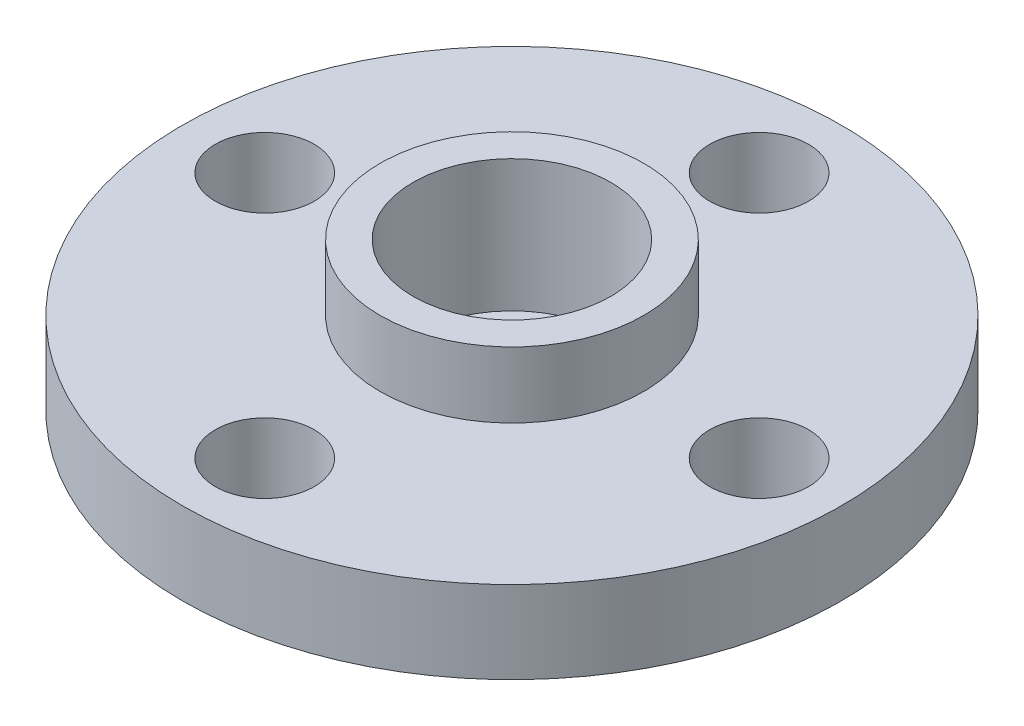
ISO-10303-21;
HEADER;
FILE_DESCRIPTION(('STEP AP214'),'2;1');
FILE_NAME('part.step','',(''),(''),'','','');
FILE_SCHEMA(('AUTOMOTIVE_DESIGN { 1 0 10303 214 1 1 1 1 }'));
ENDSEC;
DATA;
#1=APPLICATION_CONTEXT('core data for automotive mechanical design processes');
#2=APPLICATION_PROTOCOL_DEFINITION('international standard','automotive_design',2000,#1);
#3=PRODUCT_CONTEXT('',#1,'mechanical');
#4=PRODUCT('Part','Part','',(#3));
#5=PRODUCT_RELATED_PRODUCT_CATEGORY('part','',(#4));
#6=PRODUCT_DEFINITION_FORMATION('','',#4);
#7=PRODUCT_DEFINITION_CONTEXT('part definition',#1,'design');
#8=PRODUCT_DEFINITION('design','',#6,#7);
#9=PRODUCT_DEFINITION_SHAPE('','',#8);
#10=(LENGTH_UNIT() NAMED_UNIT(*) SI_UNIT(.MILLI.,.METRE.));
#11=(NAMED_UNIT(*) PLANE_ANGLE_UNIT() SI_UNIT($,.RADIAN.));
#12=(NAMED_UNIT(*) SI_UNIT($,.STERADIAN.) SOLID_ANGLE_UNIT());
#13=UNCERTAINTY_MEASURE_WITH_UNIT(LENGTH_MEASURE(1.E-05),#10,'distance_accuracy_value','');
#14=(GEOMETRIC_REPRESENTATION_CONTEXT(3) GLOBAL_UNCERTAINTY_ASSIGNED_CONTEXT((#13)) GLOBAL_UNIT_ASSIGNED_CONTEXT((#10,
#11,#12)) REPRESENTATION_CONTEXT('',''));
#15=CARTESIAN_POINT('',(0.,0.,0.));
#16=DIRECTION('',(0.,0.,1.));
#17=DIRECTION('',(1.,0.,0.));
#18=AXIS2_PLACEMENT_3D('',#15,#16,#17);
#19=CARTESIAN_POINT('',(0.,3.42447808333623,0.));
#20=DIRECTION('',(0.,1.,0.));
#21=DIRECTION('',(0.,0.,1.));
#22=AXIS2_PLACEMENT_3D('',#19,#20,#21);
#23=CYLINDRICAL_SURFACE('',#22,4.);
#24=CARTESIAN_POINT('',(0.,0.,0.));
#25=DIRECTION('',(0.,1.,0.));
#26=DIRECTION('',(0.,0.,1.));
#27=AXIS2_PLACEMENT_3D('',#24,#25,#26);
#28=CIRCLE('',#27,4.);
#29=CARTESIAN_POINT('',(0.,0.,4.));
#30=VERTEX_POINT('',#29);
#31=EDGE_CURVE('E10',#30,#30,#28,.T.);
#32=ORIENTED_EDGE('',*,*,#31,.F.);
#33=EDGE_LOOP('',(#32));
#34=FACE_BOUND('',#33,.T.);
#35=CARTESIAN_POINT('',(0.,-2.,0.));
#36=DIRECTION('',(0.,1.,0.));
#37=DIRECTION('',(0.,0.,1.));
#38=AXIS2_PLACEMENT_3D('',#35,#36,#37);
#39=CIRCLE('',#38,4.);
#40=CARTESIAN_POINT('',(0.,-2.,4.));
#41=VERTEX_POINT('',#40);
#42=EDGE_CURVE('E63',#41,#41,#39,.T.);
#43=ORIENTED_EDGE('',*,*,#42,.T.);
#44=EDGE_LOOP('',(#43));
#45=FACE_BOUND('',#44,.T.);
#46=ADVANCED_FACE('F36',(#34,#45),#23,.T.);
#47=CARTESIAN_POINT('',(3.,0.,0.));
#48=DIRECTION('',(0.,-1.,0.));
#49=DIRECTION('',(0.,0.,-1.));
#50=AXIS2_PLACEMENT_3D('',#47,#48,#49);
#51=PLANE('',#50);
#52=CARTESIAN_POINT('',(0.,0.,0.));
#53=DIRECTION('',(0.,1.,0.));
#54=DIRECTION('',(0.,0.,1.));
#55=AXIS2_PLACEMENT_3D('',#52,#53,#54);
#56=CIRCLE('',#55,3.);
#57=CARTESIAN_POINT('',(0.,0.,3.));
#58=VERTEX_POINT('',#57);
#59=EDGE_CURVE('E43',#58,#58,#56,.T.);
#60=ORIENTED_EDGE('',*,*,#59,.F.);
#61=EDGE_LOOP('',(#60));
#62=FACE_BOUND('',#61,.T.);
#63=ORIENTED_EDGE('',*,*,#31,.T.);
#64=EDGE_LOOP('',(#63));
#65=FACE_BOUND('',#64,.T.);
#66=ADVANCED_FACE('F93',(#62,#65),#51,.F.);
#67=CARTESIAN_POINT('',(0.,3.42447808333623,0.));
#68=DIRECTION('',(0.,1.,0.));
#69=DIRECTION('',(0.,0.,1.));
#70=AXIS2_PLACEMENT_3D('',#67,#68,#69);
#71=CYLINDRICAL_SURFACE('',#70,3.);
#72=CARTESIAN_POINT('',(0.,-4.,0.));
#73=DIRECTION('',(0.,1.,0.));
#74=DIRECTION('',(0.,0.,1.));
#75=AXIS2_PLACEMENT_3D('',#72,#73,#74);
#76=CIRCLE('',#75,3.);
#77=CARTESIAN_POINT('',(0.,-4.,3.));
#78=VERTEX_POINT('',#77);
#79=EDGE_CURVE('E48',#78,#78,#76,.T.);
#80=ORIENTED_EDGE('',*,*,#79,.F.);
#81=EDGE_LOOP('',(#80));
#82=FACE_BOUND('',#81,.T.);
#83=ORIENTED_EDGE('',*,*,#59,.T.);
#84=EDGE_LOOP('',(#83));
#85=FACE_BOUND('',#84,.T.);
#86=ADVANCED_FACE('F90',(#82,#85),#71,.F.);
#87=CARTESIAN_POINT('',(3.,-4.,0.));
#88=DIRECTION('',(0.,-1.,0.));
#89=DIRECTION('',(0.,0.,-1.));
#90=AXIS2_PLACEMENT_3D('',#87,#88,#89);
#91=PLANE('',#90);
#92=CARTESIAN_POINT('',(0.,-4.,0.));
#93=DIRECTION('',(0.,1.,0.));
#94=DIRECTION('',(0.,0.,1.));
#95=AXIS2_PLACEMENT_3D('',#92,#93,#94);
#96=CIRCLE('',#95,1.5);
#97=CARTESIAN_POINT('',(0.,-4.,1.5));
#98=VERTEX_POINT('',#97);
#99=EDGE_CURVE('E83',#98,#98,#96,.T.);
#100=ORIENTED_EDGE('',*,*,#99,.F.);
#101=EDGE_LOOP('',(#100));
#102=FACE_BOUND('',#101,.T.);
#103=ORIENTED_EDGE('',*,*,#79,.T.);
#104=EDGE_LOOP('',(#103));
#105=FACE_BOUND('',#104,.T.);
#106=ADVANCED_FACE('F88',(#102,#105),#91,.F.);
#107=CARTESIAN_POINT('',(0.,3.42447808333623,0.));
#108=DIRECTION('',(0.,1.,0.));
#109=DIRECTION('',(0.,0.,1.));
#110=AXIS2_PLACEMENT_3D('',#107,#108,#109);
#111=CYLINDRICAL_SURFACE('',#110,1.5);
#112=CARTESIAN_POINT('',(0.,-4.5,0.));
#113=DIRECTION('',(0.,1.,0.));
#114=DIRECTION('',(0.,0.,1.));
#115=AXIS2_PLACEMENT_3D('',#112,#113,#114);
#116=CIRCLE('',#115,1.5);
#117=CARTESIAN_POINT('',(0.,-4.5,1.5));
#118=VERTEX_POINT('',#117);
#119=EDGE_CURVE('E80',#118,#118,#116,.T.);
#120=ORIENTED_EDGE('',*,*,#119,.F.);
#121=EDGE_LOOP('',(#120));
#122=FACE_BOUND('',#121,.T.);
#123=ORIENTED_EDGE('',*,*,#99,.T.);
#124=EDGE_LOOP('',(#123));
#125=FACE_BOUND('',#124,.T.);
#126=ADVANCED_FACE('F105',(#122,#125),#111,.F.);
#127=CARTESIAN_POINT('',(10.,-4.5,0.));
#128=DIRECTION('',(0.,1.,0.));
#129=DIRECTION('',(0.,0.,1.));
#130=AXIS2_PLACEMENT_3D('',#127,#128,#129);
#131=PLANE('',#130);
#132=CARTESIAN_POINT('',(0.,-4.5,-7.5));
#133=DIRECTION('',(0.,-1.,0.));
#134=DIRECTION('',(0.,0.,-1.));
#135=AXIS2_PLACEMENT_3D('',#132,#133,#134);
#136=CIRCLE('',#135,1.5);
#137=CARTESIAN_POINT('',(0.,-4.5,-9.));
#138=VERTEX_POINT('',#137);
#139=EDGE_CURVE('E56',#138,#138,#136,.T.);
#140=ORIENTED_EDGE('',*,*,#139,.F.);
#141=EDGE_LOOP('',(#140));
#142=FACE_BOUND('',#141,.T.);
#143=CARTESIAN_POINT('',(-7.5,-4.5,0.));
#144=DIRECTION('',(0.,-1.,0.));
#145=DIRECTION('',(0.,0.,-1.));
#146=AXIS2_PLACEMENT_3D('',#143,#144,#145);
#147=CIRCLE('',#146,1.5);
#148=CARTESIAN_POINT('',(-7.5,-4.5,-1.5));
#149=VERTEX_POINT('',#148);
#150=EDGE_CURVE('E141',#149,#149,#147,.T.);
#151=ORIENTED_EDGE('',*,*,#150,.F.);
#152=EDGE_LOOP('',(#151));
#153=FACE_BOUND('',#152,.T.);
#154=CARTESIAN_POINT('',(0.,-4.5,7.5));
#155=DIRECTION('',(0.,-1.,0.));
#156=DIRECTION('',(0.,0.,-1.));
#157=AXIS2_PLACEMENT_3D('',#154,#155,#156);
#158=CIRCLE('',#157,1.5);
#159=CARTESIAN_POINT('',(0.,-4.5,6.));
#160=VERTEX_POINT('',#159);
#161=EDGE_CURVE('E144',#160,#160,#158,.T.);
#162=ORIENTED_EDGE('',*,*,#161,.F.);
#163=EDGE_LOOP('',(#162));
#164=FACE_BOUND('',#163,.T.);
#165=CARTESIAN_POINT('',(7.50000000000001,-4.5,0.));
#166=DIRECTION('',(0.,-1.,0.));
#167=DIRECTION('',(0.,0.,-1.));
#168=AXIS2_PLACEMENT_3D('',#165,#166,#167);
#169=CIRCLE('',#168,1.5);
#170=CARTESIAN_POINT('',(7.50000000000001,-4.5,-1.5));
#171=VERTEX_POINT('',#170);
#172=EDGE_CURVE('E75',#171,#171,#169,.T.);
#173=ORIENTED_EDGE('',*,*,#172,.F.);
#174=EDGE_LOOP('',(#173));
#175=FACE_BOUND('',#174,.T.);
#176=CARTESIAN_POINT('',(0.,-4.5,0.));
#177=DIRECTION('',(0.,1.,0.));
#178=DIRECTION('',(0.,0.,1.));
#179=AXIS2_PLACEMENT_3D('',#176,#177,#178);
#180=CIRCLE('',#179,10.);
#181=CARTESIAN_POINT('',(0.,-4.5,10.));
#182=VERTEX_POINT('',#181);
#183=EDGE_CURVE('E72',#182,#182,#180,.T.);
#184=ORIENTED_EDGE('',*,*,#183,.F.);
#185=EDGE_LOOP('',(#184));
#186=FACE_BOUND('',#185,.T.);
#187=ORIENTED_EDGE('',*,*,#119,.T.);
#188=EDGE_LOOP('',(#187));
#189=FACE_BOUND('',#188,.T.);
#190=ADVANCED_FACE('F109',(#142,#153,#164,#175,#186,#189),#131,.F.);
#191=CARTESIAN_POINT('',(0.,3.42447808333623,0.));
#192=DIRECTION('',(0.,1.,0.));
#193=DIRECTION('',(0.,0.,1.));
#194=AXIS2_PLACEMENT_3D('',#191,#192,#193);
#195=CYLINDRICAL_SURFACE('',#194,10.);
#196=CARTESIAN_POINT('',(0.,-2.,0.));
#197=DIRECTION('',(0.,1.,0.));
#198=DIRECTION('',(0.,0.,1.));
#199=AXIS2_PLACEMENT_3D('',#196,#197,#198);
#200=CIRCLE('',#199,10.);
#201=CARTESIAN_POINT('',(0.,-2.,10.));
#202=VERTEX_POINT('',#201);
#203=EDGE_CURVE('E67',#202,#202,#200,.T.);
#204=ORIENTED_EDGE('',*,*,#203,.F.);
#205=EDGE_LOOP('',(#204));
#206=FACE_BOUND('',#205,.T.);
#207=ORIENTED_EDGE('',*,*,#183,.T.);
#208=EDGE_LOOP('',(#207));
#209=FACE_BOUND('',#208,.T.);
#210=ADVANCED_FACE('F113',(#206,#209),#195,.T.);
#211=CARTESIAN_POINT('',(4.,-2.,0.));
#212=DIRECTION('',(0.,-1.,0.));
#213=DIRECTION('',(0.,0.,-1.));
#214=AXIS2_PLACEMENT_3D('',#211,#212,#213);
#215=PLANE('',#214);
#216=CARTESIAN_POINT('',(0.,-2.,-7.5));
#217=DIRECTION('',(0.,-1.,0.));
#218=DIRECTION('',(0.,0.,-1.));
#219=AXIS2_PLACEMENT_3D('',#216,#217,#218);
#220=CIRCLE('',#219,1.5);
#221=CARTESIAN_POINT('',(0.,-2.,-9.));
#222=VERTEX_POINT('',#221);
#223=EDGE_CURVE('E39',#222,#222,#220,.T.);
#224=ORIENTED_EDGE('',*,*,#223,.T.);
#225=EDGE_LOOP('',(#224));
#226=FACE_BOUND('',#225,.T.);
#227=CARTESIAN_POINT('',(-7.5,-2.,0.));
#228=DIRECTION('',(0.,-1.,0.));
#229=DIRECTION('',(0.,0.,-1.));
#230=AXIS2_PLACEMENT_3D('',#227,#228,#229);
#231=CIRCLE('',#230,1.5);
#232=CARTESIAN_POINT('',(-7.5,-2.,-1.5));
#233=VERTEX_POINT('',#232);
#234=EDGE_CURVE('E58',#233,#233,#231,.T.);
#235=ORIENTED_EDGE('',*,*,#234,.T.);
#236=EDGE_LOOP('',(#235));
#237=FACE_BOUND('',#236,.T.);
#238=CARTESIAN_POINT('',(0.,-2.,7.5));
#239=DIRECTION('',(0.,-1.,0.));
#240=DIRECTION('',(0.,0.,-1.));
#241=AXIS2_PLACEMENT_3D('',#238,#239,#240);
#242=CIRCLE('',#241,1.5);
#243=CARTESIAN_POINT('',(0.,-2.,6.));
#244=VERTEX_POINT('',#243);
#245=EDGE_CURVE('E55',#244,#244,#242,.T.);
#246=ORIENTED_EDGE('',*,*,#245,.T.);
#247=EDGE_LOOP('',(#246));
#248=FACE_BOUND('',#247,.T.);
#249=CARTESIAN_POINT('',(7.50000000000001,-2.,0.));
#250=DIRECTION('',(0.,-1.,0.));
#251=DIRECTION('',(0.,0.,-1.));
#252=AXIS2_PLACEMENT_3D('',#249,#250,#251);
#253=CIRCLE('',#252,1.5);
#254=CARTESIAN_POINT('',(7.50000000000001,-2.,-1.5));
#255=VERTEX_POINT('',#254);
#256=EDGE_CURVE('E52',#255,#255,#253,.T.);
#257=ORIENTED_EDGE('',*,*,#256,.T.);
#258=EDGE_LOOP('',(#257));
#259=FACE_BOUND('',#258,.T.);
#260=ORIENTED_EDGE('',*,*,#42,.F.);
#261=EDGE_LOOP('',(#260));
#262=FACE_BOUND('',#261,.T.);
#263=ORIENTED_EDGE('',*,*,#203,.T.);
#264=EDGE_LOOP('',(#263));
#265=FACE_BOUND('',#264,.T.);
#266=ADVANCED_FACE('F117',(#226,#237,#248,#259,#262,#265),#215,.F.);
#267=CARTESIAN_POINT('',(7.50000000000001,5.5,0.));
#268=DIRECTION('',(0.,-1.,0.));
#269=DIRECTION('',(0.,0.,-1.));
#270=AXIS2_PLACEMENT_3D('',#267,#268,#269);
#271=CYLINDRICAL_SURFACE('',#270,1.5);
#272=ORIENTED_EDGE('',*,*,#172,.T.);
#273=EDGE_LOOP('',(#272));
#274=FACE_BOUND('',#273,.T.);
#275=ORIENTED_EDGE('',*,*,#256,.F.);
#276=EDGE_LOOP('',(#275));
#277=FACE_BOUND('',#276,.T.);
#278=ADVANCED_FACE('F121',(#274,#277),#271,.F.);
#279=CARTESIAN_POINT('',(0.,5.5,7.5));
#280=DIRECTION('',(0.,-1.,0.));
#281=DIRECTION('',(0.,0.,-1.));
#282=AXIS2_PLACEMENT_3D('',#279,#280,#281);
#283=CYLINDRICAL_SURFACE('',#282,1.5);
#284=ORIENTED_EDGE('',*,*,#161,.T.);
#285=EDGE_LOOP('',(#284));
#286=FACE_BOUND('',#285,.T.);
#287=ORIENTED_EDGE('',*,*,#245,.F.);
#288=EDGE_LOOP('',(#287));
#289=FACE_BOUND('',#288,.T.);
#290=ADVANCED_FACE('F124',(#286,#289),#283,.F.);
#291=CARTESIAN_POINT('',(-7.5,5.5,0.));
#292=DIRECTION('',(0.,-1.,0.));
#293=DIRECTION('',(0.,0.,-1.));
#294=AXIS2_PLACEMENT_3D('',#291,#292,#293);
#295=CYLINDRICAL_SURFACE('',#294,1.5);
#296=ORIENTED_EDGE('',*,*,#150,.T.);
#297=EDGE_LOOP('',(#296));
#298=FACE_BOUND('',#297,.T.);
#299=ORIENTED_EDGE('',*,*,#234,.F.);
#300=EDGE_LOOP('',(#299));
#301=FACE_BOUND('',#300,.T.);
#302=ADVANCED_FACE('F128',(#298,#301),#295,.F.);
#303=CARTESIAN_POINT('',(0.,5.5,-7.5));
#304=DIRECTION('',(0.,-1.,0.));
#305=DIRECTION('',(0.,0.,-1.));
#306=AXIS2_PLACEMENT_3D('',#303,#304,#305);
#307=CYLINDRICAL_SURFACE('',#306,1.5);
#308=ORIENTED_EDGE('',*,*,#139,.T.);
#309=EDGE_LOOP('',(#308));
#310=FACE_BOUND('',#309,.T.);
#311=ORIENTED_EDGE('',*,*,#223,.F.);
#312=EDGE_LOOP('',(#311));
#313=FACE_BOUND('',#312,.T.);
#314=ADVANCED_FACE('F132',(#310,#313),#307,.F.);
#315=CLOSED_SHELL('',(#46,#66,#86,#106,#126,#190,#210,#266,#278,#290,#302,#314));
#316=MANIFOLD_SOLID_BREP('B2',#315);
#317=ADVANCED_BREP_SHAPE_REPRESENTATION('',(#18,#316),#14);
#318=SHAPE_DEFINITION_REPRESENTATION(#9,#317);
ENDSEC;
END-ISO-10303-21;
